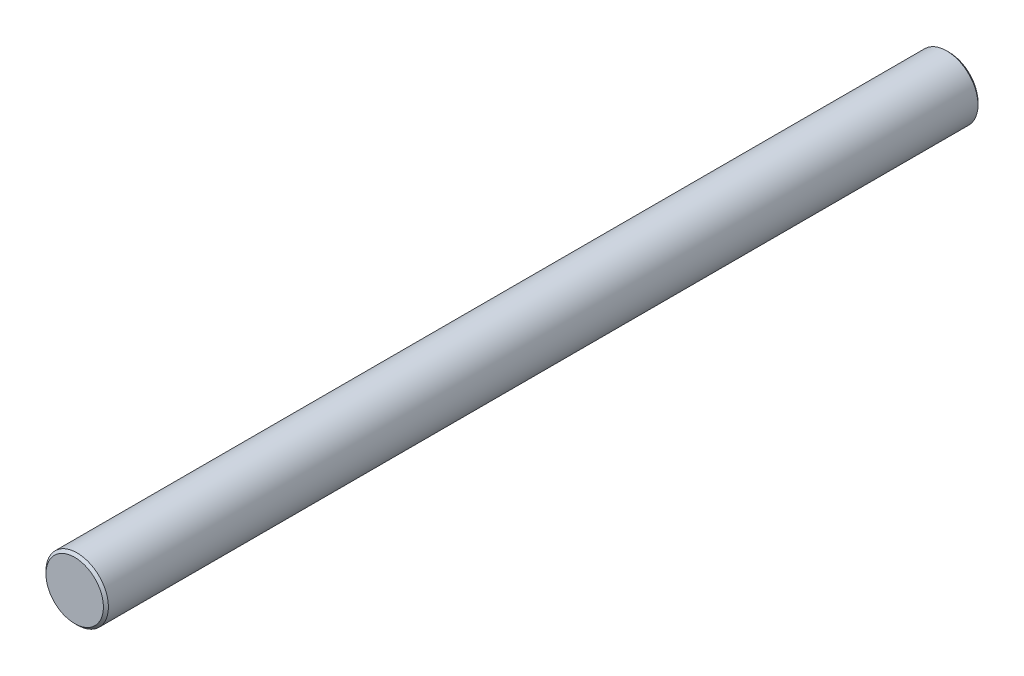
ISO-10303-21;
HEADER;
FILE_DESCRIPTION(('STEP AP214'),'2;1');
FILE_NAME('part.step','',(''),(''),'','','');
FILE_SCHEMA(('AUTOMOTIVE_DESIGN { 1 0 10303 214 1 1 1 1 }'));
ENDSEC;
DATA;
#1=APPLICATION_CONTEXT('core data for automotive mechanical design processes');
#2=APPLICATION_PROTOCOL_DEFINITION('international standard','automotive_design',2000,#1);
#3=PRODUCT_CONTEXT('',#1,'mechanical');
#4=PRODUCT('Part','Part','',(#3));
#5=PRODUCT_RELATED_PRODUCT_CATEGORY('part','',(#4));
#6=PRODUCT_DEFINITION_FORMATION('','',#4);
#7=PRODUCT_DEFINITION_CONTEXT('part definition',#1,'design');
#8=PRODUCT_DEFINITION('design','',#6,#7);
#9=PRODUCT_DEFINITION_SHAPE('','',#8);
#10=(LENGTH_UNIT() NAMED_UNIT(*) SI_UNIT(.MILLI.,.METRE.));
#11=(NAMED_UNIT(*) PLANE_ANGLE_UNIT() SI_UNIT($,.RADIAN.));
#12=(NAMED_UNIT(*) SI_UNIT($,.STERADIAN.) SOLID_ANGLE_UNIT());
#13=UNCERTAINTY_MEASURE_WITH_UNIT(LENGTH_MEASURE(1.E-05),#10,'distance_accuracy_value','');
#14=(GEOMETRIC_REPRESENTATION_CONTEXT(3) GLOBAL_UNCERTAINTY_ASSIGNED_CONTEXT((#13)) GLOBAL_UNIT_ASSIGNED_CONTEXT((#10,
#11,#12)) REPRESENTATION_CONTEXT('',''));
#15=CARTESIAN_POINT('',(0.,0.,0.));
#16=DIRECTION('',(0.,0.,1.));
#17=DIRECTION('',(1.,0.,0.));
#18=AXIS2_PLACEMENT_3D('',#15,#16,#17);
#19=CARTESIAN_POINT('',(0.,0.,70.));
#20=DIRECTION('',(0.,0.,-1.));
#21=DIRECTION('',(-1.,0.,0.));
#22=AXIS2_PLACEMENT_3D('',#19,#20,#21);
#23=CYLINDRICAL_SURFACE('',#22,2.5);
#24=CARTESIAN_POINT('',(0.,0.,0.200000000000006));
#25=DIRECTION('',(0.,0.,1.));
#26=DIRECTION('',(1.,0.,0.));
#27=AXIS2_PLACEMENT_3D('',#24,#25,#26);
#28=CIRCLE('',#27,2.5);
#29=CARTESIAN_POINT('',(2.5,0.,0.200000000000006));
#30=VERTEX_POINT('',#29);
#31=EDGE_CURVE('E46',#30,#30,#28,.T.);
#32=ORIENTED_EDGE('',*,*,#31,.T.);
#33=EDGE_LOOP('',(#32));
#34=FACE_BOUND('',#33,.T.);
#35=CARTESIAN_POINT('',(0.,0.,69.8));
#36=DIRECTION('',(0.,0.,1.));
#37=DIRECTION('',(1.,0.,0.));
#38=AXIS2_PLACEMENT_3D('',#35,#36,#37);
#39=CIRCLE('',#38,2.5);
#40=CARTESIAN_POINT('',(2.5,0.,69.8));
#41=VERTEX_POINT('',#40);
#42=EDGE_CURVE('E50',#41,#41,#39,.F.);
#43=ORIENTED_EDGE('',*,*,#42,.T.);
#44=EDGE_LOOP('',(#43));
#45=FACE_BOUND('',#44,.T.);
#46=ADVANCED_FACE('F35',(#34,#45),#23,.T.);
#47=CARTESIAN_POINT('',(0.,0.,70.));
#48=DIRECTION('',(0.,0.,1.));
#49=DIRECTION('',(1.,0.,0.));
#50=AXIS2_PLACEMENT_3D('',#47,#48,#49);
#51=PLANE('',#50);
#52=CARTESIAN_POINT('',(0.,0.,70.));
#53=DIRECTION('',(0.,0.,1.));
#54=DIRECTION('',(1.,0.,0.));
#55=AXIS2_PLACEMENT_3D('',#52,#53,#54);
#56=CIRCLE('',#55,2.30000000000001);
#57=CARTESIAN_POINT('',(2.30000000000001,0.,70.));
#58=VERTEX_POINT('',#57);
#59=EDGE_CURVE('E10',#58,#58,#56,.T.);
#60=ORIENTED_EDGE('',*,*,#59,.T.);
#61=EDGE_LOOP('',(#60));
#62=FACE_BOUND('',#61,.T.);
#63=ADVANCED_FACE('F66',(#62),#51,.T.);
#64=CARTESIAN_POINT('',(0.,0.,0.));
#65=DIRECTION('',(0.,0.,1.));
#66=DIRECTION('',(1.,0.,0.));
#67=AXIS2_PLACEMENT_3D('',#64,#65,#66);
#68=PLANE('',#67);
#69=CARTESIAN_POINT('',(0.,0.,0.));
#70=DIRECTION('',(0.,0.,1.));
#71=DIRECTION('',(1.,0.,0.));
#72=AXIS2_PLACEMENT_3D('',#69,#70,#71);
#73=CIRCLE('',#72,2.29999999999999);
#74=CARTESIAN_POINT('',(2.29999999999999,0.,0.));
#75=VERTEX_POINT('',#74);
#76=EDGE_CURVE('E42',#75,#75,#73,.F.);
#77=ORIENTED_EDGE('',*,*,#76,.T.);
#78=EDGE_LOOP('',(#77));
#79=FACE_BOUND('',#78,.T.);
#80=ADVANCED_FACE('F63',(#79),#68,.F.);
#81=CARTESIAN_POINT('',(0.,0.,0.200000000000006));
#82=DIRECTION('',(0.,0.,1.));
#83=DIRECTION('',(1.,0.,0.));
#84=AXIS2_PLACEMENT_3D('',#81,#82,#83);
#85=CONICAL_SURFACE('',#84,2.5,0.78539816339746);
#86=ORIENTED_EDGE('',*,*,#76,.F.);
#87=EDGE_LOOP('',(#86));
#88=FACE_BOUND('',#87,.T.);
#89=ORIENTED_EDGE('',*,*,#31,.F.);
#90=EDGE_LOOP('',(#89));
#91=FACE_BOUND('',#90,.T.);
#92=ADVANCED_FACE('F59',(#88,#91),#85,.T.);
#93=CARTESIAN_POINT('',(0.,0.,70.));
#94=DIRECTION('',(0.,0.,-1.));
#95=DIRECTION('',(-1.,0.,0.));
#96=AXIS2_PLACEMENT_3D('',#93,#94,#95);
#97=CONICAL_SURFACE('',#96,2.30000000000001,0.785398163397443);
#98=ORIENTED_EDGE('',*,*,#42,.F.);
#99=EDGE_LOOP('',(#98));
#100=FACE_BOUND('',#99,.T.);
#101=ORIENTED_EDGE('',*,*,#59,.F.);
#102=EDGE_LOOP('',(#101));
#103=FACE_BOUND('',#102,.T.);
#104=ADVANCED_FACE('F37',(#100,#103),#97,.T.);
#105=CLOSED_SHELL('',(#46,#63,#80,#92,#104));
#106=MANIFOLD_SOLID_BREP('B2',#105);
#107=ADVANCED_BREP_SHAPE_REPRESENTATION('',(#18,#106),#14);
#108=SHAPE_DEFINITION_REPRESENTATION(#9,#107);
ENDSEC;
END-ISO-10303-21;
